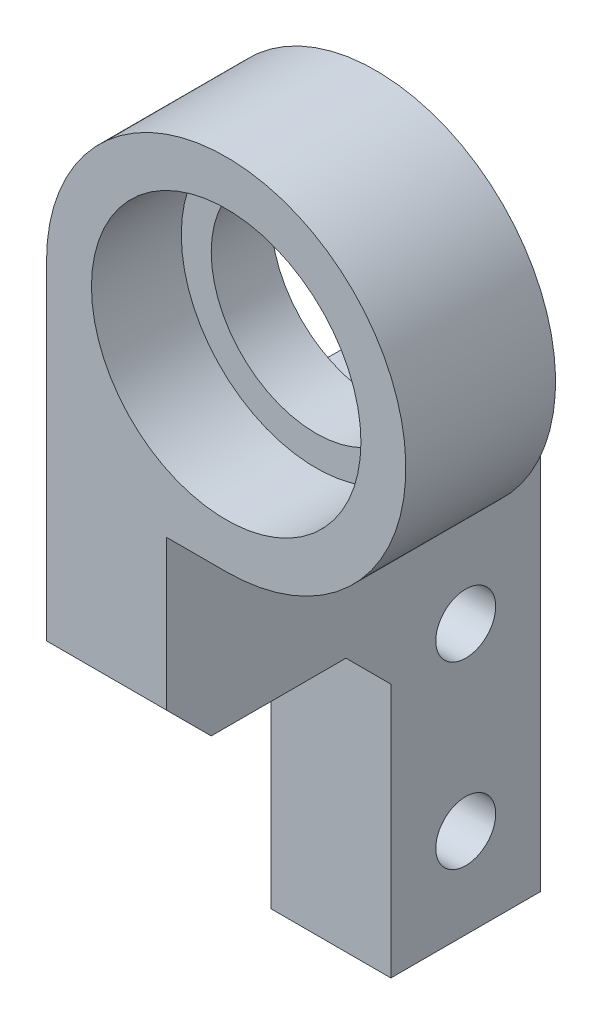
ISO-10303-21;
HEADER;
FILE_DESCRIPTION(('STEP AP214'),'2;1');
FILE_NAME('part.step','',(''),(''),'','','');
FILE_SCHEMA(('AUTOMOTIVE_DESIGN { 1 0 10303 214 1 1 1 1 }'));
ENDSEC;
DATA;
#1=APPLICATION_CONTEXT('core data for automotive mechanical design processes');
#2=APPLICATION_PROTOCOL_DEFINITION('international standard','automotive_design',2000,#1);
#3=PRODUCT_CONTEXT('',#1,'mechanical');
#4=PRODUCT('Part','Part','',(#3));
#5=PRODUCT_RELATED_PRODUCT_CATEGORY('part','',(#4));
#6=PRODUCT_DEFINITION_FORMATION('','',#4);
#7=PRODUCT_DEFINITION_CONTEXT('part definition',#1,'design');
#8=PRODUCT_DEFINITION('design','',#6,#7);
#9=PRODUCT_DEFINITION_SHAPE('','',#8);
#10=(LENGTH_UNIT() NAMED_UNIT(*) SI_UNIT(.MILLI.,.METRE.));
#11=(NAMED_UNIT(*) PLANE_ANGLE_UNIT() SI_UNIT($,.RADIAN.));
#12=(NAMED_UNIT(*) SI_UNIT($,.STERADIAN.) SOLID_ANGLE_UNIT());
#13=UNCERTAINTY_MEASURE_WITH_UNIT(LENGTH_MEASURE(1.E-05),#10,'distance_accuracy_value','');
#14=(GEOMETRIC_REPRESENTATION_CONTEXT(3) GLOBAL_UNCERTAINTY_ASSIGNED_CONTEXT((#13)) GLOBAL_UNIT_ASSIGNED_CONTEXT((#10,
#11,#12)) REPRESENTATION_CONTEXT('',''));
#15=CARTESIAN_POINT('',(0.,0.,0.));
#16=DIRECTION('',(0.,0.,1.));
#17=DIRECTION('',(1.,0.,0.));
#18=AXIS2_PLACEMENT_3D('',#15,#16,#17);
#19=CARTESIAN_POINT('',(12.,45.,12.5));
#20=DIRECTION('',(0.,0.,-1.));
#21=DIRECTION('',(-1.,0.,0.));
#22=AXIS2_PLACEMENT_3D('',#19,#20,#21);
#23=CYLINDRICAL_SURFACE('',#22,7.);
#24=CARTESIAN_POINT('',(12.,45.,2.5));
#25=DIRECTION('',(0.,0.,-1.));
#26=DIRECTION('',(0.,1.,0.));
#27=AXIS2_PLACEMENT_3D('',#24,#25,#26);
#28=CIRCLE('',#27,7.);
#29=CARTESIAN_POINT('',(12.,52.,2.5));
#30=VERTEX_POINT('',#29);
#31=EDGE_CURVE('E167',#30,#30,#28,.T.);
#32=ORIENTED_EDGE('',*,*,#31,.T.);
#33=EDGE_LOOP('',(#32));
#34=FACE_BOUND('',#33,.T.);
#35=CARTESIAN_POINT('',(12.,45.,6.5));
#36=DIRECTION('',(0.,0.,1.));
#37=DIRECTION('',(1.,0.,0.));
#38=AXIS2_PLACEMENT_3D('',#35,#36,#37);
#39=CIRCLE('',#38,7.);
#40=CARTESIAN_POINT('',(19.,45.,6.5));
#41=VERTEX_POINT('',#40);
#42=EDGE_CURVE('E187',#41,#41,#39,.T.);
#43=ORIENTED_EDGE('',*,*,#42,.T.);
#44=EDGE_LOOP('',(#43));
#45=FACE_BOUND('',#44,.T.);
#46=ADVANCED_FACE('F37',(#34,#45),#23,.F.);
#47=CARTESIAN_POINT('',(12.,45.,12.5));
#48=DIRECTION('',(0.,0.,1.));
#49=DIRECTION('',(1.,0.,0.));
#50=AXIS2_PLACEMENT_3D('',#47,#48,#49);
#51=PLANE('',#50);
#52=CARTESIAN_POINT('',(12.,45.,12.5));
#53=DIRECTION('',(0.,0.,1.));
#54=DIRECTION('',(1.,0.,0.));
#55=AXIS2_PLACEMENT_3D('',#52,#53,#54);
#56=CIRCLE('',#55,9.);
#57=CARTESIAN_POINT('',(21.,45.,12.5));
#58=VERTEX_POINT('',#57);
#59=EDGE_CURVE('E478',#58,#58,#56,.T.);
#60=ORIENTED_EDGE('',*,*,#59,.F.);
#61=EDGE_LOOP('',(#60));
#62=FACE_BOUND('',#61,.T.);
#63=DIRECTION('',(0.,-1.,0.));
#64=VECTOR('',#63,1.);
#65=CARTESIAN_POINT('',(0.,0.,12.5));
#66=LINE('',#65,#64);
#67=CARTESIAN_POINT('',(0.,45.,12.5));
#68=VERTEX_POINT('',#67);
#69=CARTESIAN_POINT('',(0.,23.,12.5));
#70=VERTEX_POINT('',#69);
#71=EDGE_CURVE('E246',#68,#70,#66,.T.);
#72=ORIENTED_EDGE('',*,*,#71,.T.);
#73=DIRECTION('',(1.,0.,0.));
#74=VECTOR('',#73,1.);
#75=CARTESIAN_POINT('',(12.,23.,12.5));
#76=LINE('',#75,#74);
#77=CARTESIAN_POINT('',(8.,23.,12.5));
#78=VERTEX_POINT('',#77);
#79=EDGE_CURVE('E215',#70,#78,#76,.T.);
#80=ORIENTED_EDGE('',*,*,#79,.T.);
#81=DIRECTION('',(0.,1.,0.));
#82=VECTOR('',#81,1.);
#83=CARTESIAN_POINT('',(8.,0.,12.5));
#84=LINE('',#83,#82);
#85=CARTESIAN_POINT('',(8.,33.,12.5));
#86=VERTEX_POINT('',#85);
#87=EDGE_CURVE('E248',#78,#86,#84,.T.);
#88=ORIENTED_EDGE('',*,*,#87,.T.);
#89=DIRECTION('',(1.,0.,0.));
#90=VECTOR('',#89,1.);
#91=CARTESIAN_POINT('',(12.,33.,12.5));
#92=LINE('',#91,#90);
#93=CARTESIAN_POINT('',(12.,33.,12.5));
#94=VERTEX_POINT('',#93);
#95=EDGE_CURVE('E251',#86,#94,#92,.T.);
#96=ORIENTED_EDGE('',*,*,#95,.T.);
#97=CARTESIAN_POINT('',(12.,45.,12.5));
#98=DIRECTION('',(0.,0.,1.));
#99=DIRECTION('',(1.,0.,0.));
#100=AXIS2_PLACEMENT_3D('',#97,#98,#99);
#101=CIRCLE('',#100,12.);
#102=EDGE_CURVE('E154',#94,#68,#101,.T.);
#103=ORIENTED_EDGE('',*,*,#102,.T.);
#104=EDGE_LOOP('',(#72,#80,#88,#96,#103));
#105=FACE_BOUND('',#104,.T.);
#106=ADVANCED_FACE('F278',(#62,#105),#51,.T.);
#107=CARTESIAN_POINT('',(12.,45.,-12.5));
#108=DIRECTION('',(0.,0.,1.));
#109=DIRECTION('',(1.,0.,0.));
#110=AXIS2_PLACEMENT_3D('',#107,#108,#109);
#111=PLANE('',#110);
#112=DIRECTION('',(0.,-1.,0.));
#113=VECTOR('',#112,1.);
#114=CARTESIAN_POINT('',(0.,0.,-12.5));
#115=LINE('',#114,#113);
#116=CARTESIAN_POINT('',(0.,27.,-12.5));
#117=VERTEX_POINT('',#116);
#118=CARTESIAN_POINT('',(0.,0.,-12.5));
#119=VERTEX_POINT('',#118);
#120=EDGE_CURVE('E245',#117,#119,#115,.T.);
#121=ORIENTED_EDGE('',*,*,#120,.F.);
#122=DIRECTION('',(1.,0.,0.));
#123=VECTOR('',#122,1.);
#124=CARTESIAN_POINT('',(8.,27.,-12.5));
#125=LINE('',#124,#123);
#126=CARTESIAN_POINT('',(8.,27.,-12.5));
#127=VERTEX_POINT('',#126);
#128=EDGE_CURVE('E198',#117,#127,#125,.T.);
#129=ORIENTED_EDGE('',*,*,#128,.T.);
#130=DIRECTION('',(0.,1.,0.));
#131=VECTOR('',#130,1.);
#132=CARTESIAN_POINT('',(8.,0.,-12.5));
#133=LINE('',#132,#131);
#134=CARTESIAN_POINT('',(8.,0.,-12.5));
#135=VERTEX_POINT('',#134);
#136=EDGE_CURVE('E249',#135,#127,#133,.T.);
#137=ORIENTED_EDGE('',*,*,#136,.F.);
#138=DIRECTION('',(1.,0.,0.));
#139=VECTOR('',#138,1.);
#140=CARTESIAN_POINT('',(0.,0.,-12.5));
#141=LINE('',#140,#139);
#142=EDGE_CURVE('E255',#119,#135,#141,.T.);
#143=ORIENTED_EDGE('',*,*,#142,.F.);
#144=EDGE_LOOP('',(#121,#129,#137,#143));
#145=FACE_BOUND('',#144,.T.);
#146=ADVANCED_FACE('F262',(#145),#111,.F.);
#147=CARTESIAN_POINT('',(0.,0.,12.5));
#148=DIRECTION('',(1.,0.,0.));
#149=DIRECTION('',(0.,0.,-1.));
#150=AXIS2_PLACEMENT_3D('',#147,#148,#149);
#151=PLANE('',#150);
#152=CARTESIAN_POINT('',(0.,18.,-7.5));
#153=DIRECTION('',(-1.,0.,0.));
#154=DIRECTION('',(0.,0.,1.));
#155=AXIS2_PLACEMENT_3D('',#152,#153,#154);
#156=CIRCLE('',#155,2.);
#157=CARTESIAN_POINT('',(0.,18.,-5.5));
#158=VERTEX_POINT('',#157);
#159=EDGE_CURVE('E184',#158,#158,#156,.T.);
#160=ORIENTED_EDGE('',*,*,#159,.F.);
#161=EDGE_LOOP('',(#160));
#162=FACE_BOUND('',#161,.T.);
#163=CARTESIAN_POINT('',(0.,6.,-7.5));
#164=DIRECTION('',(-1.,0.,0.));
#165=DIRECTION('',(0.,0.,1.));
#166=AXIS2_PLACEMENT_3D('',#163,#164,#165);
#167=CIRCLE('',#166,2.);
#168=CARTESIAN_POINT('',(0.,6.,-5.5));
#169=VERTEX_POINT('',#168);
#170=EDGE_CURVE('E190',#169,#169,#167,.T.);
#171=ORIENTED_EDGE('',*,*,#170,.F.);
#172=EDGE_LOOP('',(#171));
#173=FACE_BOUND('',#172,.T.);
#174=DIRECTION('',(0.,0.,1.));
#175=VECTOR('',#174,1.);
#176=CARTESIAN_POINT('',(0.,30.,12.5));
#177=LINE('',#176,#175);
#178=CARTESIAN_POINT('',(0.,30.,-9.5));
#179=VERTEX_POINT('',#178);
#180=CARTESIAN_POINT('',(0.,30.,-0.500000000000011));
#181=VERTEX_POINT('',#180);
#182=EDGE_CURVE('E239',#179,#181,#177,.T.);
#183=ORIENTED_EDGE('',*,*,#182,.F.);
#184=DIRECTION('',(0.,-0.707106781186547,-0.707106781186548));
#185=VECTOR('',#184,1.);
#186=CARTESIAN_POINT('',(0.,27.,-12.5));
#187=LINE('',#186,#185);
#188=EDGE_CURVE('E206',#179,#117,#187,.T.);
#189=ORIENTED_EDGE('',*,*,#188,.T.);
#190=ORIENTED_EDGE('',*,*,#120,.T.);
#191=DIRECTION('',(0.,0.,-1.));
#192=VECTOR('',#191,1.);
#193=CARTESIAN_POINT('',(0.,0.,12.5));
#194=LINE('',#193,#192);
#195=CARTESIAN_POINT('',(0.,0.,-2.5));
#196=VERTEX_POINT('',#195);
#197=EDGE_CURVE('E163',#196,#119,#194,.T.);
#198=ORIENTED_EDGE('',*,*,#197,.F.);
#199=DIRECTION('',(0.,-1.,0.));
#200=VECTOR('',#199,1.);
#201=CARTESIAN_POINT('',(0.,0.,-2.5));
#202=LINE('',#201,#200);
#203=CARTESIAN_POINT('',(0.,17.,-2.5));
#204=VERTEX_POINT('',#203);
#205=EDGE_CURVE('E237',#204,#196,#202,.T.);
#206=ORIENTED_EDGE('',*,*,#205,.F.);
#207=DIRECTION('',(0.,-0.707106781186544,-0.707106781186551));
#208=VECTOR('',#207,1.);
#209=CARTESIAN_POINT('',(0.,16.0000000000001,-3.49999999999992));
#210=LINE('',#209,#208);
#211=CARTESIAN_POINT('',(0.,20.,0.500000000000021));
#212=VERTEX_POINT('',#211);
#213=EDGE_CURVE('E12',#204,#212,#210,.F.);
#214=ORIENTED_EDGE('',*,*,#213,.T.);
#215=DIRECTION('',(0.,0.,-1.));
#216=VECTOR('',#215,1.);
#217=CARTESIAN_POINT('',(0.,20.,12.5));
#218=LINE('',#217,#216);
#219=CARTESIAN_POINT('',(0.,20.,9.5));
#220=VERTEX_POINT('',#219);
#221=EDGE_CURVE('E151',#220,#212,#218,.T.);
#222=ORIENTED_EDGE('',*,*,#221,.F.);
#223=DIRECTION('',(0.,-0.707106781186547,-0.707106781186548));
#224=VECTOR('',#223,1.);
#225=CARTESIAN_POINT('',(0.,23.,12.5));
#226=LINE('',#225,#224);
#227=EDGE_CURVE('E53',#220,#70,#226,.F.);
#228=ORIENTED_EDGE('',*,*,#227,.T.);
#229=ORIENTED_EDGE('',*,*,#71,.F.);
#230=DIRECTION('',(0.,0.,-1.));
#231=VECTOR('',#230,1.);
#232=CARTESIAN_POINT('',(0.,45.,12.5));
#233=LINE('',#232,#231);
#234=CARTESIAN_POINT('',(0.,45.,2.5));
#235=VERTEX_POINT('',#234);
#236=EDGE_CURVE('E155',#68,#235,#233,.T.);
#237=ORIENTED_EDGE('',*,*,#236,.T.);
#238=DIRECTION('',(0.,1.,0.));
#239=VECTOR('',#238,1.);
#240=CARTESIAN_POINT('',(0.,0.,2.49999999999999));
#241=LINE('',#240,#239);
#242=CARTESIAN_POINT('',(0.,33.,2.5));
#243=VERTEX_POINT('',#242);
#244=EDGE_CURVE('E136',#243,#235,#241,.T.);
#245=ORIENTED_EDGE('',*,*,#244,.F.);
#246=DIRECTION('',(0.,0.707106781186544,0.707106781186551));
#247=VECTOR('',#246,1.);
#248=CARTESIAN_POINT('',(0.,21.5000000000001,-8.99999999999994));
#249=LINE('',#248,#247);
#250=EDGE_CURVE('E220',#243,#181,#249,.F.);
#251=ORIENTED_EDGE('',*,*,#250,.T.);
#252=EDGE_LOOP('',(#183,#189,#190,#198,#206,#214,#222,#228,#229,#237,#245,#251));
#253=FACE_BOUND('',#252,.T.);
#254=ADVANCED_FACE('F272',(#162,#173,#253),#151,.F.);
#255=CARTESIAN_POINT('',(0.,0.,12.5));
#256=DIRECTION('',(0.,1.,0.));
#257=DIRECTION('',(0.,0.,1.));
#258=AXIS2_PLACEMENT_3D('',#255,#256,#257);
#259=PLANE('',#258);
#260=DIRECTION('',(1.,0.,0.));
#261=VECTOR('',#260,1.);
#262=CARTESIAN_POINT('',(-1.2E-05,0.,-2.5));
#263=LINE('',#262,#261);
#264=CARTESIAN_POINT('',(8.,0.,-2.5));
#265=VERTEX_POINT('',#264);
#266=EDGE_CURVE('E170',#196,#265,#263,.T.);
#267=ORIENTED_EDGE('',*,*,#266,.F.);
#268=ORIENTED_EDGE('',*,*,#197,.T.);
#269=ORIENTED_EDGE('',*,*,#142,.T.);
#270=DIRECTION('',(0.,0.,-1.));
#271=VECTOR('',#270,1.);
#272=CARTESIAN_POINT('',(8.,0.,12.5));
#273=LINE('',#272,#271);
#274=EDGE_CURVE('E157',#265,#135,#273,.T.);
#275=ORIENTED_EDGE('',*,*,#274,.F.);
#276=EDGE_LOOP('',(#267,#268,#269,#275));
#277=FACE_BOUND('',#276,.T.);
#278=ADVANCED_FACE('F305',(#277),#259,.F.);
#279=CARTESIAN_POINT('',(8.,0.,12.5));
#280=DIRECTION('',(-1.,0.,0.));
#281=DIRECTION('',(0.,-1.,0.));
#282=AXIS2_PLACEMENT_3D('',#279,#280,#281);
#283=PLANE('',#282);
#284=CARTESIAN_POINT('',(8.,18.,-7.5));
#285=DIRECTION('',(-1.,0.,0.));
#286=DIRECTION('',(0.,-1.,0.));
#287=AXIS2_PLACEMENT_3D('',#284,#285,#286);
#288=CIRCLE('',#287,2.);
#289=CARTESIAN_POINT('',(8.,16.,-7.5));
#290=VERTEX_POINT('',#289);
#291=EDGE_CURVE('E183',#290,#290,#288,.T.);
#292=ORIENTED_EDGE('',*,*,#291,.T.);
#293=EDGE_LOOP('',(#292));
#294=FACE_BOUND('',#293,.T.);
#295=CARTESIAN_POINT('',(8.,6.,-7.5));
#296=DIRECTION('',(-1.,0.,0.));
#297=DIRECTION('',(0.,-1.,0.));
#298=AXIS2_PLACEMENT_3D('',#295,#296,#297);
#299=CIRCLE('',#298,2.);
#300=CARTESIAN_POINT('',(8.,4.,-7.5));
#301=VERTEX_POINT('',#300);
#302=EDGE_CURVE('E180',#301,#301,#299,.T.);
#303=ORIENTED_EDGE('',*,*,#302,.T.);
#304=EDGE_LOOP('',(#303));
#305=FACE_BOUND('',#304,.T.);
#306=ORIENTED_EDGE('',*,*,#136,.T.);
#307=DIRECTION('',(0.,0.707106781186547,0.707106781186548));
#308=VECTOR('',#307,1.);
#309=CARTESIAN_POINT('',(8.,27.,-12.5));
#310=LINE('',#309,#308);
#311=CARTESIAN_POINT('',(8.,30.,-9.5));
#312=VERTEX_POINT('',#311);
#313=EDGE_CURVE('E203',#127,#312,#310,.T.);
#314=ORIENTED_EDGE('',*,*,#313,.T.);
#315=DIRECTION('',(0.,0.,-1.));
#316=VECTOR('',#315,1.);
#317=CARTESIAN_POINT('',(8.,30.,12.5));
#318=LINE('',#317,#316);
#319=CARTESIAN_POINT('',(8.,30.,-0.500000000000011));
#320=VERTEX_POINT('',#319);
#321=EDGE_CURVE('E176',#320,#312,#318,.T.);
#322=ORIENTED_EDGE('',*,*,#321,.F.);
#323=DIRECTION('',(0.,-0.707106781186544,-0.707106781186551));
#324=VECTOR('',#323,1.);
#325=CARTESIAN_POINT('',(8.,21.5000000000001,-8.99999999999994));
#326=LINE('',#325,#324);
#327=CARTESIAN_POINT('',(8.,33.,2.5));
#328=VERTEX_POINT('',#327);
#329=EDGE_CURVE('E218',#320,#328,#326,.F.);
#330=ORIENTED_EDGE('',*,*,#329,.T.);
#331=DIRECTION('',(0.,0.,-1.));
#332=VECTOR('',#331,1.);
#333=CARTESIAN_POINT('',(8.,33.,12.5));
#334=LINE('',#333,#332);
#335=EDGE_CURVE('E149',#86,#328,#334,.T.);
#336=ORIENTED_EDGE('',*,*,#335,.F.);
#337=ORIENTED_EDGE('',*,*,#87,.F.);
#338=DIRECTION('',(0.,0.707106781186547,0.707106781186548));
#339=VECTOR('',#338,1.);
#340=CARTESIAN_POINT('',(8.,23.,12.5));
#341=LINE('',#340,#339);
#342=CARTESIAN_POINT('',(8.,20.,9.5));
#343=VERTEX_POINT('',#342);
#344=EDGE_CURVE('E201',#78,#343,#341,.F.);
#345=ORIENTED_EDGE('',*,*,#344,.T.);
#346=DIRECTION('',(0.,0.,1.));
#347=VECTOR('',#346,1.);
#348=CARTESIAN_POINT('',(8.,20.,12.5));
#349=LINE('',#348,#347);
#350=CARTESIAN_POINT('',(8.,20.,0.500000000000021));
#351=VERTEX_POINT('',#350);
#352=EDGE_CURVE('E166',#351,#343,#349,.T.);
#353=ORIENTED_EDGE('',*,*,#352,.F.);
#354=DIRECTION('',(0.,0.707106781186544,0.707106781186551));
#355=VECTOR('',#354,1.);
#356=CARTESIAN_POINT('',(8.,16.0000000000001,-3.49999999999992));
#357=LINE('',#356,#355);
#358=CARTESIAN_POINT('',(8.,17.,-2.5));
#359=VERTEX_POINT('',#358);
#360=EDGE_CURVE('E46',#351,#359,#357,.F.);
#361=ORIENTED_EDGE('',*,*,#360,.T.);
#362=DIRECTION('',(0.,1.,0.));
#363=VECTOR('',#362,1.);
#364=CARTESIAN_POINT('',(8.,0.,-2.5));
#365=LINE('',#364,#363);
#366=EDGE_CURVE('E173',#265,#359,#365,.T.);
#367=ORIENTED_EDGE('',*,*,#366,.F.);
#368=ORIENTED_EDGE('',*,*,#274,.T.);
#369=EDGE_LOOP('',(#306,#314,#322,#330,#336,#337,#345,#353,#361,#367,#368));
#370=FACE_BOUND('',#369,.T.);
#371=ADVANCED_FACE('F225',(#294,#305,#370),#283,.F.);
#372=CARTESIAN_POINT('',(12.,33.,12.5));
#373=DIRECTION('',(0.,1.,0.));
#374=DIRECTION('',(-1.,0.,0.));
#375=AXIS2_PLACEMENT_3D('',#372,#373,#374);
#376=PLANE('',#375);
#377=DIRECTION('',(-1.,0.,0.));
#378=VECTOR('',#377,1.);
#379=CARTESIAN_POINT('',(12.,33.,2.5));
#380=LINE('',#379,#378);
#381=CARTESIAN_POINT('',(12.,33.,2.5));
#382=VERTEX_POINT('',#381);
#383=EDGE_CURVE('E133',#382,#328,#380,.T.);
#384=ORIENTED_EDGE('',*,*,#383,.F.);
#385=DIRECTION('',(0.,0.,-1.));
#386=VECTOR('',#385,1.);
#387=CARTESIAN_POINT('',(12.,33.,12.5));
#388=LINE('',#387,#386);
#389=EDGE_CURVE('E146',#94,#382,#388,.T.);
#390=ORIENTED_EDGE('',*,*,#389,.F.);
#391=ORIENTED_EDGE('',*,*,#95,.F.);
#392=ORIENTED_EDGE('',*,*,#335,.T.);
#393=EDGE_LOOP('',(#384,#390,#391,#392));
#394=FACE_BOUND('',#393,.T.);
#395=ADVANCED_FACE('F144',(#394),#376,.F.);
#396=CARTESIAN_POINT('',(12.,45.,12.5));
#397=DIRECTION('',(0.,0.,-1.));
#398=DIRECTION('',(-1.,0.,0.));
#399=AXIS2_PLACEMENT_3D('',#396,#397,#398);
#400=CYLINDRICAL_SURFACE('',#399,12.);
#401=ORIENTED_EDGE('',*,*,#236,.F.);
#402=ORIENTED_EDGE('',*,*,#102,.F.);
#403=ORIENTED_EDGE('',*,*,#389,.T.);
#404=CARTESIAN_POINT('',(12.,45.,2.5));
#405=DIRECTION('',(0.,0.,-1.));
#406=DIRECTION('',(0.,1.,0.));
#407=AXIS2_PLACEMENT_3D('',#404,#405,#406);
#408=CIRCLE('',#407,12.);
#409=EDGE_CURVE('E130',#235,#382,#408,.T.);
#410=ORIENTED_EDGE('',*,*,#409,.F.);
#411=EDGE_LOOP('',(#401,#402,#403,#410));
#412=FACE_BOUND('',#411,.T.);
#413=ADVANCED_FACE('F153',(#412),#400,.T.);
#414=CARTESIAN_POINT('',(-1.2E-05,57.,2.5));
#415=DIRECTION('',(0.,0.,-1.));
#416=DIRECTION('',(0.,1.,0.));
#417=AXIS2_PLACEMENT_3D('',#414,#415,#416);
#418=PLANE('',#417);
#419=ORIENTED_EDGE('',*,*,#31,.F.);
#420=EDGE_LOOP('',(#419));
#421=FACE_BOUND('',#420,.T.);
#422=ORIENTED_EDGE('',*,*,#383,.T.);
#423=DIRECTION('',(-1.,0.,0.));
#424=VECTOR('',#423,1.);
#425=CARTESIAN_POINT('',(0.,33.,2.5));
#426=LINE('',#425,#424);
#427=EDGE_CURVE('E196',#328,#243,#426,.T.);
#428=ORIENTED_EDGE('',*,*,#427,.T.);
#429=ORIENTED_EDGE('',*,*,#244,.T.);
#430=ORIENTED_EDGE('',*,*,#409,.T.);
#431=EDGE_LOOP('',(#422,#428,#429,#430));
#432=FACE_BOUND('',#431,.T.);
#433=ADVANCED_FACE('F132',(#421,#432),#418,.T.);
#434=CARTESIAN_POINT('',(-1.2E-05,30.,-12.5));
#435=DIRECTION('',(0.,1.,0.));
#436=DIRECTION('',(0.,0.,1.));
#437=AXIS2_PLACEMENT_3D('',#434,#435,#436);
#438=PLANE('',#437);
#439=ORIENTED_EDGE('',*,*,#182,.T.);
#440=DIRECTION('',(1.,0.,0.));
#441=VECTOR('',#440,1.);
#442=CARTESIAN_POINT('',(8.,30.,-0.500000000000011));
#443=LINE('',#442,#441);
#444=EDGE_CURVE('E193',#181,#320,#443,.T.);
#445=ORIENTED_EDGE('',*,*,#444,.T.);
#446=ORIENTED_EDGE('',*,*,#321,.T.);
#447=DIRECTION('',(-1.,0.,0.));
#448=VECTOR('',#447,1.);
#449=CARTESIAN_POINT('',(0.,30.,-9.5));
#450=LINE('',#449,#448);
#451=EDGE_CURVE('E179',#312,#179,#450,.T.);
#452=ORIENTED_EDGE('',*,*,#451,.T.);
#453=EDGE_LOOP('',(#439,#445,#446,#452));
#454=FACE_BOUND('',#453,.T.);
#455=ADVANCED_FACE('F270',(#454),#438,.T.);
#456=CARTESIAN_POINT('',(-1.2E-05,0.,-2.5));
#457=DIRECTION('',(0.,0.,1.));
#458=DIRECTION('',(1.,0.,0.));
#459=AXIS2_PLACEMENT_3D('',#456,#457,#458);
#460=PLANE('',#459);
#461=ORIENTED_EDGE('',*,*,#366,.T.);
#462=DIRECTION('',(-1.,0.,0.));
#463=VECTOR('',#462,1.);
#464=CARTESIAN_POINT('',(0.,17.,-2.5));
#465=LINE('',#464,#463);
#466=EDGE_CURVE('E213',#359,#204,#465,.T.);
#467=ORIENTED_EDGE('',*,*,#466,.T.);
#468=ORIENTED_EDGE('',*,*,#205,.T.);
#469=ORIENTED_EDGE('',*,*,#266,.T.);
#470=EDGE_LOOP('',(#461,#467,#468,#469));
#471=FACE_BOUND('',#470,.T.);
#472=ADVANCED_FACE('F231',(#471),#460,.T.);
#473=CARTESIAN_POINT('',(-1.2E-05,20.,-2.5));
#474=DIRECTION('',(0.,-1.,0.));
#475=DIRECTION('',(0.,0.,-1.));
#476=AXIS2_PLACEMENT_3D('',#473,#474,#475);
#477=PLANE('',#476);
#478=ORIENTED_EDGE('',*,*,#221,.T.);
#479=DIRECTION('',(1.,0.,0.));
#480=VECTOR('',#479,1.);
#481=CARTESIAN_POINT('',(8.,20.,0.500000000000021));
#482=LINE('',#481,#480);
#483=EDGE_CURVE('E210',#212,#351,#482,.T.);
#484=ORIENTED_EDGE('',*,*,#483,.T.);
#485=ORIENTED_EDGE('',*,*,#352,.T.);
#486=DIRECTION('',(-1.,0.,0.));
#487=VECTOR('',#486,1.);
#488=CARTESIAN_POINT('',(-1.2E-05,20.,9.5));
#489=LINE('',#488,#487);
#490=EDGE_CURVE('E208',#343,#220,#489,.T.);
#491=ORIENTED_EDGE('',*,*,#490,.T.);
#492=EDGE_LOOP('',(#478,#484,#485,#491));
#493=FACE_BOUND('',#492,.T.);
#494=ADVANCED_FACE('F235',(#493),#477,.T.);
#495=CARTESIAN_POINT('',(24.,6.,-7.5));
#496=DIRECTION('',(-1.,0.,0.));
#497=DIRECTION('',(0.,0.,1.));
#498=AXIS2_PLACEMENT_3D('',#495,#496,#497);
#499=CYLINDRICAL_SURFACE('',#498,2.);
#500=ORIENTED_EDGE('',*,*,#170,.T.);
#501=EDGE_LOOP('',(#500));
#502=FACE_BOUND('',#501,.T.);
#503=ORIENTED_EDGE('',*,*,#302,.F.);
#504=EDGE_LOOP('',(#503));
#505=FACE_BOUND('',#504,.T.);
#506=ADVANCED_FACE('F380',(#502,#505),#499,.F.);
#507=CARTESIAN_POINT('',(24.,18.,-7.5));
#508=DIRECTION('',(-1.,0.,0.));
#509=DIRECTION('',(0.,0.,1.));
#510=AXIS2_PLACEMENT_3D('',#507,#508,#509);
#511=CYLINDRICAL_SURFACE('',#510,2.);
#512=ORIENTED_EDGE('',*,*,#159,.T.);
#513=EDGE_LOOP('',(#512));
#514=FACE_BOUND('',#513,.T.);
#515=ORIENTED_EDGE('',*,*,#291,.F.);
#516=EDGE_LOOP('',(#515));
#517=FACE_BOUND('',#516,.T.);
#518=ADVANCED_FACE('F367',(#514,#517),#511,.F.);
#519=CARTESIAN_POINT('',(12.,45.,6.5));
#520=DIRECTION('',(0.,0.,1.));
#521=DIRECTION('',(1.,0.,0.));
#522=AXIS2_PLACEMENT_3D('',#519,#520,#521);
#523=CYLINDRICAL_SURFACE('',#522,9.);
#524=CARTESIAN_POINT('',(12.,45.,6.5));
#525=DIRECTION('',(0.,0.,1.));
#526=DIRECTION('',(1.,0.,0.));
#527=AXIS2_PLACEMENT_3D('',#524,#525,#526);
#528=CIRCLE('',#527,9.);
#529=CARTESIAN_POINT('',(21.,45.,6.5));
#530=VERTEX_POINT('',#529);
#531=EDGE_CURVE('E191',#530,#530,#528,.T.);
#532=ORIENTED_EDGE('',*,*,#531,.F.);
#533=EDGE_LOOP('',(#532));
#534=FACE_BOUND('',#533,.T.);
#535=ORIENTED_EDGE('',*,*,#59,.T.);
#536=EDGE_LOOP('',(#535));
#537=FACE_BOUND('',#536,.T.);
#538=ADVANCED_FACE('F357',(#534,#537),#523,.F.);
#539=CARTESIAN_POINT('',(12.,45.,6.5));
#540=DIRECTION('',(0.,0.,1.));
#541=DIRECTION('',(1.,0.,0.));
#542=AXIS2_PLACEMENT_3D('',#539,#540,#541);
#543=PLANE('',#542);
#544=ORIENTED_EDGE('',*,*,#42,.F.);
#545=EDGE_LOOP('',(#544));
#546=FACE_BOUND('',#545,.T.);
#547=ORIENTED_EDGE('',*,*,#531,.T.);
#548=EDGE_LOOP('',(#547));
#549=FACE_BOUND('',#548,.T.);
#550=ADVANCED_FACE('F319',(#546,#549),#543,.T.);
#551=CARTESIAN_POINT('',(-1.2E-05,30.,-0.500000000000013));
#552=DIRECTION('',(0.,0.707106781186551,-0.707106781186544));
#553=DIRECTION('',(-1.,0.,0.));
#554=AXIS2_PLACEMENT_3D('',#551,#552,#553);
#555=PLANE('',#554);
#556=ORIENTED_EDGE('',*,*,#250,.F.);
#557=ORIENTED_EDGE('',*,*,#427,.F.);
#558=ORIENTED_EDGE('',*,*,#329,.F.);
#559=ORIENTED_EDGE('',*,*,#444,.F.);
#560=EDGE_LOOP('',(#556,#557,#558,#559));
#561=FACE_BOUND('',#560,.T.);
#562=ADVANCED_FACE('F275',(#561),#555,.T.);
#563=CARTESIAN_POINT('',(12.,27.,-12.5));
#564=DIRECTION('',(0.,0.707106781186548,-0.707106781186547));
#565=DIRECTION('',(-1.,0.,0.));
#566=AXIS2_PLACEMENT_3D('',#563,#564,#565);
#567=PLANE('',#566);
#568=ORIENTED_EDGE('',*,*,#188,.F.);
#569=ORIENTED_EDGE('',*,*,#451,.F.);
#570=ORIENTED_EDGE('',*,*,#313,.F.);
#571=ORIENTED_EDGE('',*,*,#128,.F.);
#572=EDGE_LOOP('',(#568,#569,#570,#571));
#573=FACE_BOUND('',#572,.T.);
#574=ADVANCED_FACE('F266',(#573),#567,.T.);
#575=CARTESIAN_POINT('',(-1.2E-05,20.,0.500000000000021));
#576=DIRECTION('',(0.,-0.707106781186551,0.707106781186544));
#577=DIRECTION('',(-1.,0.,0.));
#578=AXIS2_PLACEMENT_3D('',#575,#576,#577);
#579=PLANE('',#578);
#580=ORIENTED_EDGE('',*,*,#213,.F.);
#581=ORIENTED_EDGE('',*,*,#466,.F.);
#582=ORIENTED_EDGE('',*,*,#360,.F.);
#583=ORIENTED_EDGE('',*,*,#483,.F.);
#584=EDGE_LOOP('',(#580,#581,#582,#583));
#585=FACE_BOUND('',#584,.T.);
#586=ADVANCED_FACE('F233',(#585),#579,.T.);
#587=CARTESIAN_POINT('',(12.,23.,12.5));
#588=DIRECTION('',(0.,0.707106781186548,-0.707106781186547));
#589=DIRECTION('',(1.,0.,0.));
#590=AXIS2_PLACEMENT_3D('',#587,#588,#589);
#591=PLANE('',#590);
#592=ORIENTED_EDGE('',*,*,#227,.F.);
#593=ORIENTED_EDGE('',*,*,#490,.F.);
#594=ORIENTED_EDGE('',*,*,#344,.F.);
#595=ORIENTED_EDGE('',*,*,#79,.F.);
#596=EDGE_LOOP('',(#592,#593,#594,#595));
#597=FACE_BOUND('',#596,.T.);
#598=ADVANCED_FACE('F40',(#597),#591,.F.);
#599=CLOSED_SHELL('',(#46,#106,#146,#254,#278,#371,#395,#413,#433,#455,#472,#494,#506,#518,#538,
#550,#562,#574,#586,#598));
#600=MANIFOLD_SOLID_BREP('B2',#599);
#601=ADVANCED_BREP_SHAPE_REPRESENTATION('',(#18,#600),#14);
#602=SHAPE_DEFINITION_REPRESENTATION(#9,#601);
ENDSEC;
END-ISO-10303-21;
